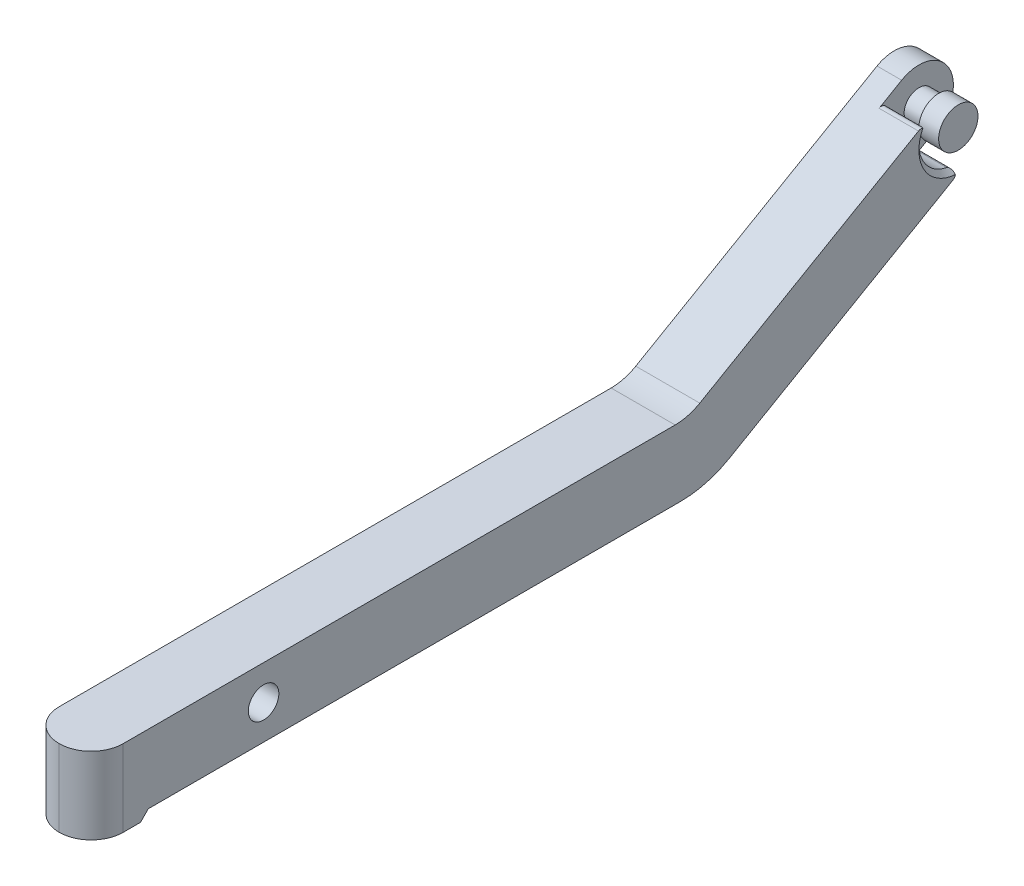
ISO-10303-21;
HEADER;
FILE_DESCRIPTION(('STEP AP214'),'2;1');
FILE_NAME('part.step','',(''),(''),'','','');
FILE_SCHEMA(('AUTOMOTIVE_DESIGN { 1 0 10303 214 1 1 1 1 }'));
ENDSEC;
DATA;
#1=APPLICATION_CONTEXT('core data for automotive mechanical design processes');
#2=APPLICATION_PROTOCOL_DEFINITION('international standard','automotive_design',2000,#1);
#3=PRODUCT_CONTEXT('',#1,'mechanical');
#4=PRODUCT('Part','Part','',(#3));
#5=PRODUCT_RELATED_PRODUCT_CATEGORY('part','',(#4));
#6=PRODUCT_DEFINITION_FORMATION('','',#4);
#7=PRODUCT_DEFINITION_CONTEXT('part definition',#1,'design');
#8=PRODUCT_DEFINITION('design','',#6,#7);
#9=PRODUCT_DEFINITION_SHAPE('','',#8);
#10=(LENGTH_UNIT() NAMED_UNIT(*) SI_UNIT(.MILLI.,.METRE.));
#11=(NAMED_UNIT(*) PLANE_ANGLE_UNIT() SI_UNIT($,.RADIAN.));
#12=(NAMED_UNIT(*) SI_UNIT($,.STERADIAN.) SOLID_ANGLE_UNIT());
#13=UNCERTAINTY_MEASURE_WITH_UNIT(LENGTH_MEASURE(1.E-05),#10,'distance_accuracy_value','');
#14=(GEOMETRIC_REPRESENTATION_CONTEXT(3) GLOBAL_UNCERTAINTY_ASSIGNED_CONTEXT((#13)) GLOBAL_UNIT_ASSIGNED_CONTEXT((#10,
#11,#12)) REPRESENTATION_CONTEXT('',''));
#15=CARTESIAN_POINT('',(0.,0.,0.));
#16=DIRECTION('',(0.,0.,1.));
#17=DIRECTION('',(1.,0.,0.));
#18=AXIS2_PLACEMENT_3D('',#15,#16,#17);
#19=CARTESIAN_POINT('',(3.25,15.2810889132454,-70.5298002192099));
#20=DIRECTION('',(-1.,0.,0.));
#21=DIRECTION('',(0.,0.,1.));
#22=AXIS2_PLACEMENT_3D('',#19,#20,#21);
#23=CYLINDRICAL_SURFACE('',#22,3.5);
#24=DIRECTION('',(-1.,0.,0.));
#25=VECTOR('',#24,1.);
#26=CARTESIAN_POINT('',(3.25,18.3121778264909,-68.7798002192099));
#27=LINE('',#26,#25);
#28=CARTESIAN_POINT('',(-0.75,18.3121778264909,-68.7798002192099));
#29=VERTEX_POINT('',#28);
#30=CARTESIAN_POINT('',(-3.25,18.3121778264909,-68.7798002192099));
#31=VERTEX_POINT('',#30);
#32=EDGE_CURVE('E176',#29,#31,#27,.T.);
#33=ORIENTED_EDGE('',*,*,#32,.F.);
#34=CARTESIAN_POINT('',(-0.75,15.2810889132454,-70.5298002192099));
#35=DIRECTION('',(1.,0.,0.));
#36=DIRECTION('',(0.,0.,-1.));
#37=AXIS2_PLACEMENT_3D('',#34,#35,#36);
#38=CIRCLE('',#37,3.50000000000001);
#39=CARTESIAN_POINT('',(-0.75,17.0310889132454,-73.5608891324555));
#40=VERTEX_POINT('',#39);
#41=EDGE_CURVE('E170',#40,#29,#38,.T.);
#42=ORIENTED_EDGE('',*,*,#41,.F.);
#43=DIRECTION('',(-1.,0.,0.));
#44=VECTOR('',#43,1.);
#45=CARTESIAN_POINT('',(3.25,17.0310889132454,-73.5608891324555));
#46=LINE('',#45,#44);
#47=CARTESIAN_POINT('',(-3.25,17.0310889132454,-73.5608891324555));
#48=VERTEX_POINT('',#47);
#49=EDGE_CURVE('E181',#48,#40,#46,.F.);
#50=ORIENTED_EDGE('',*,*,#49,.F.);
#51=CARTESIAN_POINT('',(-3.25,15.2810889132454,-70.5298002192099));
#52=DIRECTION('',(1.,0.,0.));
#53=DIRECTION('',(0.,0.,-1.));
#54=AXIS2_PLACEMENT_3D('',#51,#52,#53);
#55=CIRCLE('',#54,3.5);
#56=EDGE_CURVE('E420',#31,#48,#55,.F.);
#57=ORIENTED_EDGE('',*,*,#56,.F.);
#58=EDGE_LOOP('',(#33,#42,#50,#57));
#59=FACE_BOUND('',#58,.T.);
#60=ADVANCED_FACE('F41',(#59),#23,.T.);
#61=CARTESIAN_POINT('',(3.25,15.2810889132454,-70.5298002192099));
#62=DIRECTION('',(-1.,0.,0.));
#63=DIRECTION('',(0.,0.,1.));
#64=AXIS2_PLACEMENT_3D('',#61,#62,#63);
#65=CYLINDRICAL_SURFACE('',#64,3.5);
#66=ORIENTED_EDGE('',*,*,#49,.T.);
#67=CARTESIAN_POINT('',(-0.75,15.2810889132454,-70.5298002192099));
#68=DIRECTION('',(1.,0.,0.));
#69=DIRECTION('',(0.,0.,-1.));
#70=AXIS2_PLACEMENT_3D('',#67,#68,#69);
#71=CIRCLE('',#70,3.5);
#72=CARTESIAN_POINT('',(-0.75,12.2499999999999,-72.2798002192099));
#73=VERTEX_POINT('',#72);
#74=EDGE_CURVE('E167',#40,#73,#71,.F.);
#75=ORIENTED_EDGE('',*,*,#74,.T.);
#76=DIRECTION('',(-1.,0.,0.));
#77=VECTOR('',#76,1.);
#78=CARTESIAN_POINT('',(3.25,12.2499999999999,-72.2798002192099));
#79=LINE('',#78,#77);
#80=CARTESIAN_POINT('',(-3.25,12.2499999999999,-72.2798002192099));
#81=VERTEX_POINT('',#80);
#82=EDGE_CURVE('E423',#81,#73,#79,.F.);
#83=ORIENTED_EDGE('',*,*,#82,.F.);
#84=CARTESIAN_POINT('',(-3.25,15.2810889132454,-70.5298002192099));
#85=DIRECTION('',(1.,0.,0.));
#86=DIRECTION('',(0.,0.,-1.));
#87=AXIS2_PLACEMENT_3D('',#84,#85,#86);
#88=CIRCLE('',#87,3.5);
#89=EDGE_CURVE('E187',#48,#81,#88,.F.);
#90=ORIENTED_EDGE('',*,*,#89,.F.);
#91=EDGE_LOOP('',(#66,#75,#83,#90));
#92=FACE_BOUND('',#91,.T.);
#93=ADVANCED_FACE('F186',(#92),#65,.T.);
#94=CARTESIAN_POINT('',(3.25,0.,0.));
#95=DIRECTION('',(1.,0.,0.));
#96=DIRECTION('',(0.,0.,-1.));
#97=AXIS2_PLACEMENT_3D('',#94,#95,#96);
#98=PLANE('',#97);
#99=DIRECTION('',(0.,0.499999999999995,-0.866025403784442));
#100=VECTOR('',#99,1.);
#101=CARTESIAN_POINT('',(3.25,-3.49999999999999,-45.));
#102=LINE('',#101,#100);
#103=CARTESIAN_POINT('',(3.25,-2.16025403784441,-47.3205080756887));
#104=VERTEX_POINT('',#103);
#105=CARTESIAN_POINT('',(3.25,10.9271243444676,-69.988512371732));
#106=VERTEX_POINT('',#105);
#107=EDGE_CURVE('E344',#104,#106,#102,.T.);
#108=ORIENTED_EDGE('',*,*,#107,.T.);
#109=CARTESIAN_POINT('',(3.25,11.3601370463598,-69.738512371732));
#110=DIRECTION('',(1.,0.,0.));
#111=DIRECTION('',(0.,0.,-1.));
#112=AXIS2_PLACEMENT_3D('',#109,#110,#111);
#113=CIRCLE('',#112,0.5);
#114=CARTESIAN_POINT('',(3.25,11.2920518764218,-70.2338550911036));
#115=VERTEX_POINT('',#114);
#116=EDGE_CURVE('E210',#106,#115,#113,.T.);
#117=ORIENTED_EDGE('',*,*,#116,.T.);
#118=CARTESIAN_POINT('',(3.25,15.2810889132454,-70.5298002192099));
#119=DIRECTION('',(1.,0.,0.));
#120=DIRECTION('',(0.,0.,-1.));
#121=AXIS2_PLACEMENT_3D('',#118,#119,#120);
#122=CIRCLE('',#121,4.00000000000001);
#123=CARTESIAN_POINT('',(3.25,17.0193114325909,-66.9272202446306));
#124=VERTEX_POINT('',#123);
#125=EDGE_CURVE('E199',#115,#124,#122,.F.);
#126=ORIENTED_EDGE('',*,*,#125,.T.);
#127=CARTESIAN_POINT('',(3.25,16.5562894690664,-66.738512371732));
#128=DIRECTION('',(1.,0.,0.));
#129=DIRECTION('',(0.,0.,-1.));
#130=AXIS2_PLACEMENT_3D('',#127,#128,#129);
#131=CIRCLE('',#130,0.5);
#132=CARTESIAN_POINT('',(3.25,16.9893021709586,-66.488512371732));
#133=VERTEX_POINT('',#132);
#134=EDGE_CURVE('E207',#124,#133,#131,.T.);
#135=ORIENTED_EDGE('',*,*,#134,.T.);
#136=DIRECTION('',(0.,-0.499999999999995,0.866025403784441));
#137=VECTOR('',#136,1.);
#138=CARTESIAN_POINT('',(3.25,20.0621778264909,-71.8108891324555));
#139=LINE('',#138,#137);
#140=CARTESIAN_POINT('',(3.25,4.1698729810778,-44.2846096908266));
#141=VERTEX_POINT('',#140);
#142=EDGE_CURVE('E347',#133,#141,#139,.T.);
#143=ORIENTED_EDGE('',*,*,#142,.T.);
#144=CARTESIAN_POINT('',(3.25,8.5,-41.7846096908266));
#145=DIRECTION('',(1.,0.,0.));
#146=DIRECTION('',(0.,0.,-1.));
#147=AXIS2_PLACEMENT_3D('',#144,#145,#146);
#148=CIRCLE('',#147,5.);
#149=CARTESIAN_POINT('',(3.25,3.5,-41.7846096908266));
#150=VERTEX_POINT('',#149);
#151=EDGE_CURVE('E409',#141,#150,#148,.F.);
#152=ORIENTED_EDGE('',*,*,#151,.T.);
#153=DIRECTION('',(0.,0.,1.));
#154=VECTOR('',#153,1.);
#155=CARTESIAN_POINT('',(3.25,3.5,17.5));
#156=LINE('',#155,#154);
#157=CARTESIAN_POINT('',(3.25,3.5,14.25));
#158=VERTEX_POINT('',#157);
#159=EDGE_CURVE('E351',#150,#158,#156,.T.);
#160=ORIENTED_EDGE('',*,*,#159,.T.);
#161=DIRECTION('',(0.,-1.,0.));
#162=VECTOR('',#161,1.);
#163=CARTESIAN_POINT('',(3.25,0.,14.25));
#164=LINE('',#163,#162);
#165=CARTESIAN_POINT('',(3.25,-4.3,14.25));
#166=VERTEX_POINT('',#165);
#167=EDGE_CURVE('E398',#158,#166,#164,.T.);
#168=ORIENTED_EDGE('',*,*,#167,.T.);
#169=DIRECTION('',(0.,0.,-1.));
#170=VECTOR('',#169,1.);
#171=CARTESIAN_POINT('',(3.25,-4.3,12.5));
#172=LINE('',#171,#170);
#173=CARTESIAN_POINT('',(3.25,-4.3,12.5));
#174=VERTEX_POINT('',#173);
#175=EDGE_CURVE('E369',#166,#174,#172,.T.);
#176=ORIENTED_EDGE('',*,*,#175,.T.);
#177=DIRECTION('',(0.,0.70710678118655,-0.707106781186545));
#178=VECTOR('',#177,1.);
#179=CARTESIAN_POINT('',(3.25,-3.5,11.7));
#180=LINE('',#179,#178);
#181=CARTESIAN_POINT('',(3.25,-3.5,11.7));
#182=VERTEX_POINT('',#181);
#183=EDGE_CURVE('E371',#174,#182,#180,.T.);
#184=ORIENTED_EDGE('',*,*,#183,.T.);
#185=DIRECTION('',(0.,0.,-1.));
#186=VECTOR('',#185,1.);
#187=CARTESIAN_POINT('',(3.25,-3.5,0.));
#188=LINE('',#187,#186);
#189=CARTESIAN_POINT('',(3.25,-3.5,-42.3205080756888));
#190=VERTEX_POINT('',#189);
#191=EDGE_CURVE('E359',#182,#190,#188,.T.);
#192=ORIENTED_EDGE('',*,*,#191,.T.);
#193=CARTESIAN_POINT('',(3.25,6.5,-42.3205080756888));
#194=DIRECTION('',(1.,0.,0.));
#195=DIRECTION('',(0.,0.,-1.));
#196=AXIS2_PLACEMENT_3D('',#193,#194,#195);
#197=CIRCLE('',#196,10.);
#198=EDGE_CURVE('E418',#190,#104,#197,.T.);
#199=ORIENTED_EDGE('',*,*,#198,.T.);
#200=EDGE_LOOP('',(#108,#117,#126,#135,#143,#152,#160,#168,#176,#184,#192,#199));
#201=FACE_BOUND('',#200,.T.);
#202=CARTESIAN_POINT('',(3.25,0.,0.));
#203=DIRECTION('',(1.,0.,0.));
#204=DIRECTION('',(0.,0.,-1.));
#205=AXIS2_PLACEMENT_3D('',#202,#203,#204);
#206=CIRCLE('',#205,1.55);
#207=CARTESIAN_POINT('',(3.25,0.,1.55));
#208=VERTEX_POINT('',#207);
#209=EDGE_CURVE('E381',#208,#208,#206,.T.);
#210=ORIENTED_EDGE('',*,*,#209,.F.);
#211=EDGE_LOOP('',(#210));
#212=FACE_BOUND('',#211,.T.);
#213=ADVANCED_FACE('F250',(#201,#212),#98,.T.);
#214=CARTESIAN_POINT('',(-3.25,0.,0.));
#215=DIRECTION('',(1.,0.,0.));
#216=DIRECTION('',(0.,0.,-1.));
#217=AXIS2_PLACEMENT_3D('',#214,#215,#216);
#218=PLANE('',#217);
#219=ORIENTED_EDGE('',*,*,#56,.T.);
#220=ORIENTED_EDGE('',*,*,#89,.T.);
#221=DIRECTION('',(0.,0.499999999999995,-0.866025403784442));
#222=VECTOR('',#221,1.);
#223=CARTESIAN_POINT('',(-3.25,-3.49999999999999,-45.));
#224=LINE('',#223,#222);
#225=CARTESIAN_POINT('',(-3.25,-2.16025403784441,-47.3205080756887));
#226=VERTEX_POINT('',#225);
#227=EDGE_CURVE('E191',#226,#81,#224,.T.);
#228=ORIENTED_EDGE('',*,*,#227,.F.);
#229=CARTESIAN_POINT('',(-3.25,6.5,-42.3205080756888));
#230=DIRECTION('',(1.,0.,0.));
#231=DIRECTION('',(0.,0.,-1.));
#232=AXIS2_PLACEMENT_3D('',#229,#230,#231);
#233=CIRCLE('',#232,10.);
#234=CARTESIAN_POINT('',(-3.25,-3.5,-42.3205080756888));
#235=VERTEX_POINT('',#234);
#236=EDGE_CURVE('E414',#226,#235,#233,.F.);
#237=ORIENTED_EDGE('',*,*,#236,.T.);
#238=DIRECTION('',(0.,0.,-1.));
#239=VECTOR('',#238,1.);
#240=CARTESIAN_POINT('',(-3.25,-3.5,0.));
#241=LINE('',#240,#239);
#242=CARTESIAN_POINT('',(-3.25,-3.5,11.7));
#243=VERTEX_POINT('',#242);
#244=EDGE_CURVE('E364',#243,#235,#241,.T.);
#245=ORIENTED_EDGE('',*,*,#244,.F.);
#246=DIRECTION('',(0.,0.70710678118655,-0.707106781186545));
#247=VECTOR('',#246,1.);
#248=CARTESIAN_POINT('',(-3.25,-3.5,11.7));
#249=LINE('',#248,#247);
#250=CARTESIAN_POINT('',(-3.25,-4.3,12.5));
#251=VERTEX_POINT('',#250);
#252=EDGE_CURVE('E361',#251,#243,#249,.T.);
#253=ORIENTED_EDGE('',*,*,#252,.F.);
#254=DIRECTION('',(0.,0.,-1.));
#255=VECTOR('',#254,1.);
#256=CARTESIAN_POINT('',(-3.25,-4.3,12.5));
#257=LINE('',#256,#255);
#258=CARTESIAN_POINT('',(-3.25,-4.3,14.25));
#259=VERTEX_POINT('',#258);
#260=EDGE_CURVE('E358',#259,#251,#257,.T.);
#261=ORIENTED_EDGE('',*,*,#260,.F.);
#262=DIRECTION('',(0.,-1.,0.));
#263=VECTOR('',#262,1.);
#264=CARTESIAN_POINT('',(-3.25,3.5,14.25));
#265=LINE('',#264,#263);
#266=CARTESIAN_POINT('',(-3.25,3.5,14.25));
#267=VERTEX_POINT('',#266);
#268=EDGE_CURVE('E390',#259,#267,#265,.F.);
#269=ORIENTED_EDGE('',*,*,#268,.T.);
#270=DIRECTION('',(0.,0.,1.));
#271=VECTOR('',#270,1.);
#272=CARTESIAN_POINT('',(-3.25,3.5,17.5));
#273=LINE('',#272,#271);
#274=CARTESIAN_POINT('',(-3.25,3.5,-41.7846096908266));
#275=VERTEX_POINT('',#274);
#276=EDGE_CURVE('E356',#275,#267,#273,.T.);
#277=ORIENTED_EDGE('',*,*,#276,.F.);
#278=CARTESIAN_POINT('',(-3.25,8.5,-41.7846096908266));
#279=DIRECTION('',(1.,0.,0.));
#280=DIRECTION('',(0.,0.,-1.));
#281=AXIS2_PLACEMENT_3D('',#278,#279,#280);
#282=CIRCLE('',#281,5.);
#283=CARTESIAN_POINT('',(-3.25,4.1698729810778,-44.2846096908266));
#284=VERTEX_POINT('',#283);
#285=EDGE_CURVE('E406',#275,#284,#282,.T.);
#286=ORIENTED_EDGE('',*,*,#285,.T.);
#287=DIRECTION('',(0.,-0.499999999999995,0.866025403784441));
#288=VECTOR('',#287,1.);
#289=CARTESIAN_POINT('',(-3.25,20.0621778264909,-71.8108891324555));
#290=LINE('',#289,#288);
#291=EDGE_CURVE('E348',#31,#284,#290,.T.);
#292=ORIENTED_EDGE('',*,*,#291,.F.);
#293=EDGE_LOOP('',(#219,#220,#228,#237,#245,#253,#261,#269,#277,#286,#292));
#294=FACE_BOUND('',#293,.T.);
#295=CARTESIAN_POINT('',(-3.25,0.,0.));
#296=DIRECTION('',(1.,0.,0.));
#297=DIRECTION('',(0.,0.,-1.));
#298=AXIS2_PLACEMENT_3D('',#295,#296,#297);
#299=CIRCLE('',#298,1.55);
#300=CARTESIAN_POINT('',(-3.25,0.,1.55));
#301=VERTEX_POINT('',#300);
#302=EDGE_CURVE('E378',#301,#301,#299,.T.);
#303=ORIENTED_EDGE('',*,*,#302,.T.);
#304=EDGE_LOOP('',(#303));
#305=FACE_BOUND('',#304,.T.);
#306=ADVANCED_FACE('F255',(#294,#305),#218,.F.);
#307=CARTESIAN_POINT('',(3.25,0.,0.));
#308=DIRECTION('',(-1.,0.,0.));
#309=DIRECTION('',(0.,0.,1.));
#310=AXIS2_PLACEMENT_3D('',#307,#308,#309);
#311=CYLINDRICAL_SURFACE('',#310,1.55);
#312=CARTESIAN_POINT('',(3.25,0.,1.55));
#313=CARTESIAN_POINT('',(3.18229166666667,0.,1.55));
#314=CARTESIAN_POINT('',(3.11458333333333,0.,1.55));
#315=CARTESIAN_POINT('',(2.97916666666667,0.,1.55));
#316=CARTESIAN_POINT('',(2.91145833333333,0.,1.55));
#317=CARTESIAN_POINT('',(2.77604166666667,0.,1.55));
#318=CARTESIAN_POINT('',(2.70833333333333,0.,1.55));
#319=CARTESIAN_POINT('',(2.57291666666667,0.,1.55));
#320=CARTESIAN_POINT('',(2.50520833333333,0.,1.55));
#321=CARTESIAN_POINT('',(2.36979166666667,0.,1.55));
#322=CARTESIAN_POINT('',(2.30208333333333,0.,1.55));
#323=CARTESIAN_POINT('',(2.16666666666667,0.,1.55));
#324=CARTESIAN_POINT('',(2.09895833333333,0.,1.55));
#325=CARTESIAN_POINT('',(1.96354166666667,0.,1.55));
#326=CARTESIAN_POINT('',(1.89583333333333,0.,1.55));
#327=CARTESIAN_POINT('',(1.76041666666667,0.,1.55));
#328=CARTESIAN_POINT('',(1.69270833333333,0.,1.55));
#329=CARTESIAN_POINT('',(1.55729166666667,0.,1.55));
#330=CARTESIAN_POINT('',(1.48958333333333,0.,1.55));
#331=CARTESIAN_POINT('',(1.35416666666667,0.,1.55));
#332=CARTESIAN_POINT('',(1.28645833333333,0.,1.55));
#333=CARTESIAN_POINT('',(1.15104166666667,0.,1.55));
#334=CARTESIAN_POINT('',(1.08333333333333,0.,1.55));
#335=CARTESIAN_POINT('',(0.947916666666667,0.,1.55));
#336=CARTESIAN_POINT('',(0.880208333333333,0.,1.55));
#337=CARTESIAN_POINT('',(0.744791666666667,0.,1.55));
#338=CARTESIAN_POINT('',(0.677083333333333,0.,1.55));
#339=CARTESIAN_POINT('',(0.541666666666667,0.,1.55));
#340=CARTESIAN_POINT('',(0.473958333333333,0.,1.55));
#341=CARTESIAN_POINT('',(0.338541666666667,0.,1.55));
#342=CARTESIAN_POINT('',(0.270833333333333,0.,1.55));
#343=CARTESIAN_POINT('',(0.135416666666667,0.,1.55));
#344=CARTESIAN_POINT('',(0.0677083333333334,0.,1.55));
#345=CARTESIAN_POINT('',(-0.0677083333333334,0.,1.55));
#346=CARTESIAN_POINT('',(-0.135416666666667,0.,1.55));
#347=CARTESIAN_POINT('',(-0.270833333333333,0.,1.55));
#348=CARTESIAN_POINT('',(-0.338541666666667,0.,1.55));
#349=CARTESIAN_POINT('',(-0.473958333333333,0.,1.55));
#350=CARTESIAN_POINT('',(-0.541666666666667,0.,1.55));
#351=CARTESIAN_POINT('',(-0.677083333333333,0.,1.55));
#352=CARTESIAN_POINT('',(-0.744791666666666,0.,1.55));
#353=CARTESIAN_POINT('',(-0.880208333333333,0.,1.55));
#354=CARTESIAN_POINT('',(-0.947916666666666,0.,1.55));
#355=CARTESIAN_POINT('',(-1.08333333333333,0.,1.55));
#356=CARTESIAN_POINT('',(-1.15104166666667,0.,1.55));
#357=CARTESIAN_POINT('',(-1.28645833333333,0.,1.55));
#358=CARTESIAN_POINT('',(-1.35416666666667,0.,1.55));
#359=CARTESIAN_POINT('',(-1.48958333333333,0.,1.55));
#360=CARTESIAN_POINT('',(-1.55729166666667,0.,1.55));
#361=CARTESIAN_POINT('',(-1.69270833333333,0.,1.55));
#362=CARTESIAN_POINT('',(-1.76041666666667,0.,1.55));
#363=CARTESIAN_POINT('',(-1.89583333333333,0.,1.55));
#364=CARTESIAN_POINT('',(-1.96354166666667,0.,1.55));
#365=CARTESIAN_POINT('',(-2.09895833333333,0.,1.55));
#366=CARTESIAN_POINT('',(-2.16666666666667,0.,1.55));
#367=CARTESIAN_POINT('',(-2.30208333333333,0.,1.55));
#368=CARTESIAN_POINT('',(-2.36979166666667,0.,1.55));
#369=CARTESIAN_POINT('',(-2.50520833333333,0.,1.55));
#370=CARTESIAN_POINT('',(-2.57291666666667,0.,1.55));
#371=CARTESIAN_POINT('',(-2.70833333333333,0.,1.55));
#372=CARTESIAN_POINT('',(-2.77604166666667,0.,1.55));
#373=CARTESIAN_POINT('',(-2.91145833333333,0.,1.55));
#374=CARTESIAN_POINT('',(-2.97916666666667,0.,1.55));
#375=CARTESIAN_POINT('',(-3.11458333333333,0.,1.55));
#376=CARTESIAN_POINT('',(-3.18229166666667,0.,1.55));
#377=CARTESIAN_POINT('',(-3.25,0.,1.55));
#378=B_SPLINE_CURVE_WITH_KNOTS('',3,(#312,#313,#314,#315,#316,#317,#318,#319,#320,#321,#322,
#323,#324,#325,#326,#327,#328,#329,#330,#331,#332,#333,#334,#335,#336,#337,#338,#339,#340,#341,
#342,#343,#344,#345,#346,#347,#348,#349,#350,#351,#352,#353,#354,#355,#356,#357,#358,#359,#360,
#361,#362,#363,#364,#365,#366,#367,#368,#369,#370,#371,#372,#373,#374,#375,#376,#377),
.UNSPECIFIED.,.F.,.F.,(4,2,2,2,2,2,2,2,2,2,2,2,2,2,2,2,2,2,2,2,2,2,2,2,2,2,2,2,2,2,2,2,4),(0.,
0.203125,0.40625,0.609375,0.8125,1.015625,1.21875,1.421875,1.625,1.828125,2.03125,2.234375,
2.4375,2.640625,2.84375,3.046875,3.25,3.453125,3.65625,3.859375,4.0625,4.265625,4.46875,
4.671875,4.875,5.078125,5.28125,5.484375,5.6875,5.890625,6.09375,6.296875,6.5),.UNSPECIFIED.);
#379=EDGE_CURVE('BSEAM277',#208,#301,#378,.T.);
#380=ORIENTED_EDGE('',*,*,#209,.T.);
#381=ORIENTED_EDGE('',*,*,#302,.F.);
#382=ORIENTED_EDGE('',*,*,#379,.T.);
#383=ORIENTED_EDGE('',*,*,#379,.F.);
#384=EDGE_LOOP('',(#380,#382,#381,#383));
#385=FACE_BOUND('',#384,.T.);
#386=ADVANCED_FACE('F277',(#385),#311,.F.);
#387=CARTESIAN_POINT('',(-3.25,-3.5,0.));
#388=DIRECTION('',(0.,-1.,0.));
#389=DIRECTION('',(0.,0.,-1.));
#390=AXIS2_PLACEMENT_3D('',#387,#388,#389);
#391=PLANE('',#390);
#392=ORIENTED_EDGE('',*,*,#244,.T.);
#393=DIRECTION('',(-1.,0.,0.));
#394=VECTOR('',#393,1.);
#395=CARTESIAN_POINT('',(3.25,-3.49999999999999,-42.3205080756888));
#396=LINE('',#395,#394);
#397=EDGE_CURVE('E416',#235,#190,#396,.F.);
#398=ORIENTED_EDGE('',*,*,#397,.T.);
#399=ORIENTED_EDGE('',*,*,#191,.F.);
#400=DIRECTION('',(1.,0.,0.));
#401=VECTOR('',#400,1.);
#402=CARTESIAN_POINT('',(-3.25,-3.5,11.7));
#403=LINE('',#402,#401);
#404=EDGE_CURVE('E376',#243,#182,#403,.T.);
#405=ORIENTED_EDGE('',*,*,#404,.F.);
#406=EDGE_LOOP('',(#392,#398,#399,#405));
#407=FACE_BOUND('',#406,.T.);
#408=ADVANCED_FACE('F282',(#407),#391,.T.);
#409=CARTESIAN_POINT('',(-3.25,-3.5,11.7));
#410=DIRECTION('',(0.,-0.707106781186545,-0.70710678118655));
#411=DIRECTION('',(0.,0.70710678118655,-0.707106781186545));
#412=AXIS2_PLACEMENT_3D('',#409,#410,#411);
#413=PLANE('',#412);
#414=ORIENTED_EDGE('',*,*,#183,.F.);
#415=DIRECTION('',(1.,0.,0.));
#416=VECTOR('',#415,1.);
#417=CARTESIAN_POINT('',(-3.25,-4.3,12.5));
#418=LINE('',#417,#416);
#419=EDGE_CURVE('E367',#251,#174,#418,.T.);
#420=ORIENTED_EDGE('',*,*,#419,.F.);
#421=ORIENTED_EDGE('',*,*,#252,.T.);
#422=ORIENTED_EDGE('',*,*,#404,.T.);
#423=EDGE_LOOP('',(#414,#420,#421,#422));
#424=FACE_BOUND('',#423,.T.);
#425=ADVANCED_FACE('F292',(#424),#413,.T.);
#426=CARTESIAN_POINT('',(-3.25,-4.3,12.5));
#427=DIRECTION('',(0.,-1.,0.));
#428=DIRECTION('',(0.,0.,-1.));
#429=AXIS2_PLACEMENT_3D('',#426,#427,#428);
#430=PLANE('',#429);
#431=CARTESIAN_POINT('',(0.,-4.3,14.25));
#432=DIRECTION('',(0.,-1.,0.));
#433=DIRECTION('',(0.,0.,-1.));
#434=AXIS2_PLACEMENT_3D('',#431,#432,#433);
#435=CIRCLE('',#434,3.25);
#436=CARTESIAN_POINT('',(0.,-4.3,17.5));
#437=VERTEX_POINT('',#436);
#438=EDGE_CURVE('E384',#166,#437,#435,.T.);
#439=ORIENTED_EDGE('',*,*,#438,.T.);
#440=CARTESIAN_POINT('',(0.,-4.3,14.25));
#441=DIRECTION('',(0.,-1.,0.));
#442=DIRECTION('',(0.,0.,-1.));
#443=AXIS2_PLACEMENT_3D('',#440,#441,#442);
#444=CIRCLE('',#443,3.25);
#445=EDGE_CURVE('E388',#437,#259,#444,.T.);
#446=ORIENTED_EDGE('',*,*,#445,.T.);
#447=ORIENTED_EDGE('',*,*,#260,.T.);
#448=ORIENTED_EDGE('',*,*,#419,.T.);
#449=ORIENTED_EDGE('',*,*,#175,.F.);
#450=EDGE_LOOP('',(#439,#446,#447,#448,#449));
#451=FACE_BOUND('',#450,.T.);
#452=ADVANCED_FACE('F288',(#451),#430,.T.);
#453=CARTESIAN_POINT('',(-3.25,3.5,17.5));
#454=DIRECTION('',(0.,1.,0.));
#455=DIRECTION('',(0.,0.,1.));
#456=AXIS2_PLACEMENT_3D('',#453,#454,#455);
#457=PLANE('',#456);
#458=ORIENTED_EDGE('',*,*,#159,.F.);
#459=DIRECTION('',(-1.,0.,0.));
#460=VECTOR('',#459,1.);
#461=CARTESIAN_POINT('',(-3.25,3.5,-41.7846096908266));
#462=LINE('',#461,#460);
#463=EDGE_CURVE('E399',#150,#275,#462,.T.);
#464=ORIENTED_EDGE('',*,*,#463,.T.);
#465=ORIENTED_EDGE('',*,*,#276,.T.);
#466=CARTESIAN_POINT('',(0.,3.5,14.25));
#467=DIRECTION('',(0.,1.,0.));
#468=DIRECTION('',(0.,0.,1.));
#469=AXIS2_PLACEMENT_3D('',#466,#467,#468);
#470=CIRCLE('',#469,3.25);
#471=CARTESIAN_POINT('',(0.,3.5,17.5));
#472=VERTEX_POINT('',#471);
#473=EDGE_CURVE('E396',#267,#472,#470,.T.);
#474=ORIENTED_EDGE('',*,*,#473,.T.);
#475=CARTESIAN_POINT('',(0.,3.5,14.25));
#476=DIRECTION('',(0.,1.,0.));
#477=DIRECTION('',(0.,0.,1.));
#478=AXIS2_PLACEMENT_3D('',#475,#476,#477);
#479=CIRCLE('',#478,3.25);
#480=EDGE_CURVE('E393',#472,#158,#479,.T.);
#481=ORIENTED_EDGE('',*,*,#480,.T.);
#482=EDGE_LOOP('',(#458,#464,#465,#474,#481));
#483=FACE_BOUND('',#482,.T.);
#484=ADVANCED_FACE('F284',(#483),#457,.T.);
#485=CARTESIAN_POINT('',(3.25,-3.49999999999999,-45.));
#486=DIRECTION('',(0.,0.866025403784442,0.499999999999995));
#487=DIRECTION('',(0.,-0.499999999999995,0.866025403784442));
#488=AXIS2_PLACEMENT_3D('',#485,#486,#487);
#489=PLANE('',#488);
#490=DIRECTION('',(0.,-0.499999999999995,0.866025403784442));
#491=VECTOR('',#490,1.);
#492=CARTESIAN_POINT('',(-0.75,12.2499999999998,-72.2798002192099));
#493=LINE('',#492,#491);
#494=CARTESIAN_POINT('',(-0.75,10.9271243444676,-69.988512371732));
#495=VERTEX_POINT('',#494);
#496=EDGE_CURVE('E58',#73,#495,#493,.T.);
#497=ORIENTED_EDGE('',*,*,#496,.T.);
#498=DIRECTION('',(1.,0.,0.));
#499=VECTOR('',#498,1.);
#500=CARTESIAN_POINT('',(3.25,10.9271243444676,-69.988512371732));
#501=LINE('',#500,#499);
#502=EDGE_CURVE('E204',#495,#106,#501,.T.);
#503=ORIENTED_EDGE('',*,*,#502,.T.);
#504=ORIENTED_EDGE('',*,*,#107,.F.);
#505=DIRECTION('',(-1.,0.,0.));
#506=VECTOR('',#505,1.);
#507=CARTESIAN_POINT('',(-3.25,-2.16025403784441,-47.3205080756887));
#508=LINE('',#507,#506);
#509=EDGE_CURVE('E411',#104,#226,#508,.T.);
#510=ORIENTED_EDGE('',*,*,#509,.T.);
#511=ORIENTED_EDGE('',*,*,#227,.T.);
#512=ORIENTED_EDGE('',*,*,#82,.T.);
#513=EDGE_LOOP('',(#497,#503,#504,#510,#511,#512));
#514=FACE_BOUND('',#513,.T.);
#515=ADVANCED_FACE('F287',(#514),#489,.F.);
#516=CARTESIAN_POINT('',(3.25,20.0621778264909,-71.8108891324555));
#517=DIRECTION('',(0.,-0.866025403784441,-0.499999999999995));
#518=DIRECTION('',(0.,0.499999999999995,-0.866025403784441));
#519=AXIS2_PLACEMENT_3D('',#516,#517,#518);
#520=PLANE('',#519);
#521=ORIENTED_EDGE('',*,*,#142,.F.);
#522=DIRECTION('',(1.,0.,0.));
#523=VECTOR('',#522,1.);
#524=CARTESIAN_POINT('',(3.25,16.9893021709586,-66.488512371732));
#525=LINE('',#524,#523);
#526=CARTESIAN_POINT('',(-0.75,16.9893021709586,-66.488512371732));
#527=VERTEX_POINT('',#526);
#528=EDGE_CURVE('E434',#133,#527,#525,.F.);
#529=ORIENTED_EDGE('',*,*,#528,.T.);
#530=DIRECTION('',(0.,0.499999999999995,-0.866025403784441));
#531=VECTOR('',#530,1.);
#532=CARTESIAN_POINT('',(-0.75,18.3121778264909,-68.7798002192099));
#533=LINE('',#532,#531);
#534=EDGE_CURVE('E428',#527,#29,#533,.T.);
#535=ORIENTED_EDGE('',*,*,#534,.T.);
#536=ORIENTED_EDGE('',*,*,#32,.T.);
#537=ORIENTED_EDGE('',*,*,#291,.T.);
#538=DIRECTION('',(-1.,0.,0.));
#539=VECTOR('',#538,1.);
#540=CARTESIAN_POINT('',(3.25,4.1698729810778,-44.2846096908266));
#541=LINE('',#540,#539);
#542=EDGE_CURVE('E403',#284,#141,#541,.F.);
#543=ORIENTED_EDGE('',*,*,#542,.T.);
#544=EDGE_LOOP('',(#521,#529,#535,#536,#537,#543));
#545=FACE_BOUND('',#544,.T.);
#546=ADVANCED_FACE('F271',(#545),#520,.F.);
#547=CARTESIAN_POINT('',(0.,0.,14.25));
#548=DIRECTION('',(0.,-1.,0.));
#549=DIRECTION('',(0.,0.,-1.));
#550=AXIS2_PLACEMENT_3D('',#547,#548,#549);
#551=CYLINDRICAL_SURFACE('',#550,3.25);
#552=ORIENTED_EDGE('',*,*,#167,.F.);
#553=ORIENTED_EDGE('',*,*,#480,.F.);
#554=DIRECTION('',(0.,-1.,0.));
#555=VECTOR('',#554,1.);
#556=CARTESIAN_POINT('',(0.,-4.3,17.5));
#557=LINE('',#556,#555);
#558=EDGE_CURVE('E188',#437,#472,#557,.F.);
#559=ORIENTED_EDGE('',*,*,#558,.F.);
#560=ORIENTED_EDGE('',*,*,#438,.F.);
#561=EDGE_LOOP('',(#552,#553,#559,#560));
#562=FACE_BOUND('',#561,.T.);
#563=ADVANCED_FACE('F268',(#562),#551,.T.);
#564=CARTESIAN_POINT('',(0.,-4.3,14.25));
#565=DIRECTION('',(0.,1.,0.));
#566=DIRECTION('',(0.,0.,1.));
#567=AXIS2_PLACEMENT_3D('',#564,#565,#566);
#568=CYLINDRICAL_SURFACE('',#567,3.25);
#569=ORIENTED_EDGE('',*,*,#473,.F.);
#570=ORIENTED_EDGE('',*,*,#268,.F.);
#571=ORIENTED_EDGE('',*,*,#445,.F.);
#572=ORIENTED_EDGE('',*,*,#558,.T.);
#573=EDGE_LOOP('',(#569,#570,#571,#572));
#574=FACE_BOUND('',#573,.T.);
#575=ADVANCED_FACE('F266',(#574),#568,.T.);
#576=CARTESIAN_POINT('',(-3.25,8.5,-41.7846096908266));
#577=DIRECTION('',(-1.,0.,0.));
#578=DIRECTION('',(0.,0.,1.));
#579=AXIS2_PLACEMENT_3D('',#576,#577,#578);
#580=CYLINDRICAL_SURFACE('',#579,5.);
#581=ORIENTED_EDGE('',*,*,#151,.F.);
#582=ORIENTED_EDGE('',*,*,#542,.F.);
#583=ORIENTED_EDGE('',*,*,#285,.F.);
#584=ORIENTED_EDGE('',*,*,#463,.F.);
#585=EDGE_LOOP('',(#581,#582,#583,#584));
#586=FACE_BOUND('',#585,.T.);
#587=ADVANCED_FACE('F262',(#586),#580,.F.);
#588=CARTESIAN_POINT('',(3.25,6.5,-42.3205080756888));
#589=DIRECTION('',(1.,0.,0.));
#590=DIRECTION('',(0.,0.,-1.));
#591=AXIS2_PLACEMENT_3D('',#588,#589,#590);
#592=CYLINDRICAL_SURFACE('',#591,10.);
#593=ORIENTED_EDGE('',*,*,#198,.F.);
#594=ORIENTED_EDGE('',*,*,#397,.F.);
#595=ORIENTED_EDGE('',*,*,#236,.F.);
#596=ORIENTED_EDGE('',*,*,#509,.F.);
#597=EDGE_LOOP('',(#593,#594,#595,#596));
#598=FACE_BOUND('',#597,.T.);
#599=ADVANCED_FACE('F259',(#598),#592,.T.);
#600=CARTESIAN_POINT('',(-0.75,15.2810889132454,-70.5298002192099));
#601=DIRECTION('',(1.,0.,0.));
#602=DIRECTION('',(0.,0.,-1.));
#603=AXIS2_PLACEMENT_3D('',#600,#601,#602);
#604=CYLINDRICAL_SURFACE('',#603,3.50000000000001);
#605=CARTESIAN_POINT('',(2.75,15.2810889132454,-70.5298002192099));
#606=DIRECTION('',(1.,0.,0.));
#607=DIRECTION('',(0.,0.,-1.));
#608=AXIS2_PLACEMENT_3D('',#605,#606,#607);
#609=CIRCLE('',#608,3.50000000000001);
#610=CARTESIAN_POINT('',(2.75,16.3968893995888,-67.2124233526667));
#611=VERTEX_POINT('',#610);
#612=CARTESIAN_POINT('',(2.75,11.8502560297205,-69.8374233526667));
#613=VERTEX_POINT('',#612);
#614=EDGE_CURVE('E175',#611,#613,#609,.T.);
#615=ORIENTED_EDGE('',*,*,#614,.T.);
#616=DIRECTION('',(1.,0.,0.));
#617=VECTOR('',#616,1.);
#618=CARTESIAN_POINT('',(-0.75,11.8502560297205,-69.8374233526667));
#619=LINE('',#618,#617);
#620=CARTESIAN_POINT('',(-0.75,11.8502560297205,-69.8374233526667));
#621=VERTEX_POINT('',#620);
#622=EDGE_CURVE('E440',#613,#621,#619,.F.);
#623=ORIENTED_EDGE('',*,*,#622,.T.);
#624=CARTESIAN_POINT('',(-0.75,16.3968893995888,-67.2124233526667));
#625=VERTEX_POINT('',#624);
#626=EDGE_CURVE('E184',#625,#621,#38,.T.);
#627=ORIENTED_EDGE('',*,*,#626,.F.);
#628=DIRECTION('',(1.,0.,0.));
#629=VECTOR('',#628,1.);
#630=CARTESIAN_POINT('',(-0.75,16.3968893995888,-67.2124233526667));
#631=LINE('',#630,#629);
#632=EDGE_CURVE('E443',#625,#611,#631,.T.);
#633=ORIENTED_EDGE('',*,*,#632,.T.);
#634=EDGE_LOOP('',(#615,#623,#627,#633));
#635=FACE_BOUND('',#634,.T.);
#636=ADVANCED_FACE('F261',(#635),#604,.F.);
#637=CARTESIAN_POINT('',(-0.75,15.2810889132454,-70.5298002192099));
#638=DIRECTION('',(1.,0.,0.));
#639=DIRECTION('',(0.,0.,-1.));
#640=AXIS2_PLACEMENT_3D('',#637,#638,#639);
#641=PLANE('',#640);
#642=CARTESIAN_POINT('',(-0.75,15.2810889132454,-70.5298002192099));
#643=DIRECTION('',(1.,0.,0.));
#644=DIRECTION('',(0.,0.,-1.));
#645=AXIS2_PLACEMENT_3D('',#642,#643,#644);
#646=CIRCLE('',#645,1.5);
#647=CARTESIAN_POINT('',(-0.75,15.2810889132454,-72.0298002192099));
#648=VERTEX_POINT('',#647);
#649=EDGE_CURVE('E331',#648,#648,#646,.T.);
#650=ORIENTED_EDGE('',*,*,#649,.F.);
#651=EDGE_LOOP('',(#650));
#652=FACE_BOUND('',#651,.T.);
#653=ORIENTED_EDGE('',*,*,#41,.T.);
#654=ORIENTED_EDGE('',*,*,#534,.F.);
#655=CARTESIAN_POINT('',(-0.75,16.5562894690664,-66.738512371732));
#656=DIRECTION('',(1.,0.,0.));
#657=DIRECTION('',(0.,0.,-1.));
#658=AXIS2_PLACEMENT_3D('',#655,#656,#657);
#659=CIRCLE('',#658,0.5);
#660=EDGE_CURVE('E11',#527,#625,#659,.F.);
#661=ORIENTED_EDGE('',*,*,#660,.T.);
#662=ORIENTED_EDGE('',*,*,#626,.T.);
#663=CARTESIAN_POINT('',(-0.75,11.3601370463598,-69.738512371732));
#664=DIRECTION('',(1.,0.,0.));
#665=DIRECTION('',(0.,0.,-1.));
#666=AXIS2_PLACEMENT_3D('',#663,#664,#665);
#667=CIRCLE('',#666,0.5);
#668=EDGE_CURVE('E51',#621,#495,#667,.F.);
#669=ORIENTED_EDGE('',*,*,#668,.T.);
#670=ORIENTED_EDGE('',*,*,#496,.F.);
#671=ORIENTED_EDGE('',*,*,#74,.F.);
#672=EDGE_LOOP('',(#653,#654,#661,#662,#669,#670,#671));
#673=FACE_BOUND('',#672,.T.);
#674=ADVANCED_FACE('F169',(#652,#673),#641,.T.);
#675=CARTESIAN_POINT('',(1.25,15.2810889132454,-70.5298002192099));
#676=DIRECTION('',(-1.,0.,0.));
#677=DIRECTION('',(0.,0.,1.));
#678=AXIS2_PLACEMENT_3D('',#675,#676,#677);
#679=CYLINDRICAL_SURFACE('',#678,1.5);
#680=CARTESIAN_POINT('',(1.25,15.2810889132454,-70.5298002192099));
#681=DIRECTION('',(1.,0.,0.));
#682=DIRECTION('',(0.,0.,-1.));
#683=AXIS2_PLACEMENT_3D('',#680,#681,#682);
#684=CIRCLE('',#683,1.5);
#685=CARTESIAN_POINT('',(1.25,15.2810889132454,-72.0298002192099));
#686=VERTEX_POINT('',#685);
#687=EDGE_CURVE('E336',#686,#686,#684,.T.);
#688=ORIENTED_EDGE('',*,*,#687,.F.);
#689=EDGE_LOOP('',(#688));
#690=FACE_BOUND('',#689,.T.);
#691=ORIENTED_EDGE('',*,*,#649,.T.);
#692=EDGE_LOOP('',(#691));
#693=FACE_BOUND('',#692,.T.);
#694=ADVANCED_FACE('F311',(#690,#693),#679,.T.);
#695=CARTESIAN_POINT('',(3.25,15.2810889132454,-70.5298002192099));
#696=DIRECTION('',(-1.,0.,0.));
#697=DIRECTION('',(0.,0.,1.));
#698=AXIS2_PLACEMENT_3D('',#695,#696,#697);
#699=CYLINDRICAL_SURFACE('',#698,2.);
#700=CARTESIAN_POINT('',(3.25,15.2810889132454,-70.5298002192099));
#701=DIRECTION('',(1.,0.,0.));
#702=DIRECTION('',(0.,0.,-1.));
#703=AXIS2_PLACEMENT_3D('',#700,#701,#702);
#704=CIRCLE('',#703,2.);
#705=CARTESIAN_POINT('',(3.25,15.2810889132454,-72.5298002192099));
#706=VERTEX_POINT('',#705);
#707=EDGE_CURVE('E330',#706,#706,#704,.T.);
#708=ORIENTED_EDGE('',*,*,#707,.F.);
#709=EDGE_LOOP('',(#708));
#710=FACE_BOUND('',#709,.T.);
#711=CARTESIAN_POINT('',(1.25,15.2810889132454,-70.5298002192099));
#712=DIRECTION('',(1.,0.,0.));
#713=DIRECTION('',(0.,0.,-1.));
#714=AXIS2_PLACEMENT_3D('',#711,#712,#713);
#715=CIRCLE('',#714,2.);
#716=CARTESIAN_POINT('',(1.25,15.2810889132454,-72.5298002192099));
#717=VERTEX_POINT('',#716);
#718=EDGE_CURVE('E332',#717,#717,#715,.T.);
#719=ORIENTED_EDGE('',*,*,#718,.T.);
#720=EDGE_LOOP('',(#719));
#721=FACE_BOUND('',#720,.T.);
#722=ADVANCED_FACE('F315',(#710,#721),#699,.T.);
#723=CARTESIAN_POINT('',(3.25,15.2810889132454,-70.5298002192099));
#724=DIRECTION('',(1.,0.,0.));
#725=DIRECTION('',(0.,0.,-1.));
#726=AXIS2_PLACEMENT_3D('',#723,#724,#725);
#727=PLANE('',#726);
#728=ORIENTED_EDGE('',*,*,#707,.T.);
#729=EDGE_LOOP('',(#728));
#730=FACE_BOUND('',#729,.T.);
#731=ADVANCED_FACE('F319',(#730),#727,.T.);
#732=CARTESIAN_POINT('',(1.25,15.2810889132454,-70.5298002192099));
#733=DIRECTION('',(1.,0.,0.));
#734=DIRECTION('',(0.,0.,-1.));
#735=AXIS2_PLACEMENT_3D('',#732,#733,#734);
#736=PLANE('',#735);
#737=ORIENTED_EDGE('',*,*,#687,.T.);
#738=EDGE_LOOP('',(#737));
#739=FACE_BOUND('',#738,.T.);
#740=ORIENTED_EDGE('',*,*,#718,.F.);
#741=EDGE_LOOP('',(#740));
#742=FACE_BOUND('',#741,.T.);
#743=ADVANCED_FACE('F234',(#739,#742),#736,.F.);
#744=CARTESIAN_POINT('',(2.75,15.2810889132454,-70.5298002192099));
#745=DIRECTION('',(1.,0.,0.));
#746=DIRECTION('',(0.,0.,-1.));
#747=AXIS2_PLACEMENT_3D('',#744,#745,#746);
#748=CONICAL_SURFACE('',#747,3.50000000000001,0.785398163397453);
#749=ORIENTED_EDGE('',*,*,#125,.F.);
#750=CARTESIAN_POINT('',(3.25,11.2920518764218,-70.2338550911036));
#751=CARTESIAN_POINT('',(3.23061792225519,11.3112927565176,-70.2364925946225));
#752=CARTESIAN_POINT('',(3.21121371142574,11.3306362072592,-70.2380165747007));
#753=CARTESIAN_POINT('',(3.17244271656769,11.3694549452701,-70.2388044751033));
#754=CARTESIAN_POINT('',(3.15307601132535,11.3889303687319,-70.238065523812));
#755=CARTESIAN_POINT('',(3.09488887924488,11.4477142247638,-70.2323654163897));
#756=CARTESIAN_POINT('',(3.05632774688949,11.4870367548776,-70.2238728011786));
#757=CARTESIAN_POINT('',(2.99326793597182,11.5522742522061,-70.2009806144525));
#758=CARTESIAN_POINT('',(2.96813860692531,11.5785410719386,-70.189254234184));
#759=CARTESIAN_POINT('',(2.91980468779427,11.6298705540637,-70.1605372385957));
#760=CARTESIAN_POINT('',(2.89659377562525,11.6549370469642,-70.1435648659845));
#761=CARTESIAN_POINT('',(2.85956889332097,11.6960334696862,-70.1095426963691));
#762=CARTESIAN_POINT('',(2.84498461239632,11.7125721719954,-70.0939494578675));
#763=CARTESIAN_POINT('',(2.81802789410648,11.7441284114142,-70.0595928595016));
#764=CARTESIAN_POINT('',(2.80565298977832,11.7591476369261,-70.0408330814893));
#765=CARTESIAN_POINT('',(2.78636718671371,11.783897932658,-70.0045896102824));
#766=CARTESIAN_POINT('',(2.77885317109813,11.7940663684773,-69.9877283558585));
#767=CARTESIAN_POINT('',(2.76619893354724,11.8125974978227,-69.9522361039849));
#768=CARTESIAN_POINT('',(2.76105285426396,11.8209646194856,-69.9336096123333));
#769=CARTESIAN_POINT('',(2.75490442123419,11.8328519337865,-69.9019587725381));
#770=CARTESIAN_POINT('',(2.75307699108926,11.8370319165112,-69.8893364432546));
#771=CARTESIAN_POINT('',(2.75061966580524,11.8444083940434,-69.8636584260145));
#772=CARTESIAN_POINT('',(2.74999298056825,11.8476022335925,-69.8506016711383));
#773=CARTESIAN_POINT('',(2.75,11.8502560297205,-69.8374233526667));
#774=B_SPLINE_CURVE_WITH_KNOTS('',3,(#750,#751,#752,#753,#754,#755,#756,#757,#758,#759,#760,
#761,#762,#763,#764,#765,#766,#767,#768,#769,#770,#771,#772,#773),.UNSPECIFIED.,.F.,.F.,(4,2,2,
2,2,2,2,2,2,2,2,4),(0.,0.0822503321279658,0.164605081551248,0.330768105269316,0.445036147990319,
0.558911216078676,0.639685371475134,0.720368763549443,0.783357362381075,0.846189303214591,
0.886363202642048,0.926644348280556),.UNSPECIFIED.);
#775=EDGE_CURVE('E220',#115,#613,#774,.T.);
#776=ORIENTED_EDGE('',*,*,#775,.T.);
#777=ORIENTED_EDGE('',*,*,#614,.F.);
#778=CARTESIAN_POINT('',(2.75,16.3968893995888,-67.2124233526667));
#779=CARTESIAN_POINT('',(2.74995217984518,16.4174887857826,-67.2193928064962));
#780=CARTESIAN_POINT('',(2.75161839397566,16.4384945308336,-67.2249233628924));
#781=CARTESIAN_POINT('',(2.75794901102305,16.4803837344981,-67.2331621992872));
#782=CARTESIAN_POINT('',(2.76258158664267,16.5012661440824,-67.2358996485054));
#783=CARTESIAN_POINT('',(2.77440837214354,16.5423598037486,-67.2387449923474));
#784=CARTESIAN_POINT('',(2.78159274289921,16.5625733101928,-67.2388628779436));
#785=CARTESIAN_POINT('',(2.79802126048224,16.6020611330318,-67.2368060602457));
#786=CARTESIAN_POINT('',(2.80727119919147,16.6213326190594,-67.2346248449756));
#787=CARTESIAN_POINT('',(2.83230474194939,16.6678706299596,-67.2267226657734));
#788=CARTESIAN_POINT('',(2.84906360648817,16.6944048172582,-67.2197880167971));
#789=CARTESIAN_POINT('',(2.88492139875927,16.7445953736888,-67.202461131782));
#790=CARTESIAN_POINT('',(2.9040253081173,16.7682453959687,-67.1920614517294));
#791=CARTESIAN_POINT('',(2.95247782709168,16.8224381316597,-67.1633357436703));
#792=CARTESIAN_POINT('',(2.98264771628902,16.8514607509849,-67.1435332610155));
#793=CARTESIAN_POINT('',(3.04466945384794,16.9038469605711,-67.0995852914325));
#794=CARTESIAN_POINT('',(3.07652355170234,16.9272027369065,-67.0754338868359));
#795=CARTESIAN_POINT('',(3.132131878977,16.9626880454418,-67.0307717327259));
#796=CARTESIAN_POINT('',(3.15571340636751,16.9761400114055,-67.011077237227));
#797=CARTESIAN_POINT('',(3.20288183171627,16.9999873280882,-66.9702135202753));
#798=CARTESIAN_POINT('',(3.22646796925879,17.0103992747363,-66.9490531170305));
#799=CARTESIAN_POINT('',(3.25,17.0193114325909,-66.9272202446306));
#800=B_SPLINE_CURVE_WITH_KNOTS('',3,(#778,#779,#780,#781,#782,#783,#784,#785,#786,#787,#788,
#789,#790,#791,#792,#793,#794,#795,#796,#797,#798,#799),.UNSPECIFIED.,.F.,.F.,(4,2,2,2,2,2,2,2,
2,2,4),(0.,0.0650104440918369,0.12933479328068,0.19341376817897,0.257674729400469,
0.353557728841241,0.449648058790212,0.587839697698467,0.726220817681581,0.826676819913604,
0.926573699400315),.UNSPECIFIED.);
#801=EDGE_CURVE('E212',#611,#124,#800,.T.);
#802=ORIENTED_EDGE('',*,*,#801,.T.);
#803=EDGE_LOOP('',(#749,#776,#777,#802));
#804=FACE_BOUND('',#803,.T.);
#805=ADVANCED_FACE('F227',(#804),#748,.F.);
#806=CARTESIAN_POINT('',(-0.75,11.3601370463598,-69.738512371732));
#807=DIRECTION('',(1.,0.,0.));
#808=DIRECTION('',(0.,0.,-1.));
#809=AXIS2_PLACEMENT_3D('',#806,#807,#808);
#810=CYLINDRICAL_SURFACE('',#809,0.5);
#811=ORIENTED_EDGE('',*,*,#668,.F.);
#812=ORIENTED_EDGE('',*,*,#622,.F.);
#813=ORIENTED_EDGE('',*,*,#775,.F.);
#814=ORIENTED_EDGE('',*,*,#116,.F.);
#815=ORIENTED_EDGE('',*,*,#502,.F.);
#816=EDGE_LOOP('',(#811,#812,#813,#814,#815));
#817=FACE_BOUND('',#816,.T.);
#818=ADVANCED_FACE('F233',(#817),#810,.T.);
#819=CARTESIAN_POINT('',(-0.75,16.5562894690664,-66.738512371732));
#820=DIRECTION('',(1.,0.,0.));
#821=DIRECTION('',(0.,0.,-1.));
#822=AXIS2_PLACEMENT_3D('',#819,#820,#821);
#823=CYLINDRICAL_SURFACE('',#822,0.5);
#824=ORIENTED_EDGE('',*,*,#801,.F.);
#825=ORIENTED_EDGE('',*,*,#632,.F.);
#826=ORIENTED_EDGE('',*,*,#660,.F.);
#827=ORIENTED_EDGE('',*,*,#528,.F.);
#828=ORIENTED_EDGE('',*,*,#134,.F.);
#829=EDGE_LOOP('',(#824,#825,#826,#827,#828));
#830=FACE_BOUND('',#829,.T.);
#831=ADVANCED_FACE('F43',(#830),#823,.T.);
#832=CLOSED_SHELL('',(#60,#93,#213,#306,#386,#408,#425,#452,#484,#515,#546,#563,#575,#587,#599,
#636,#674,#694,#722,#731,#743,#805,#818,#831));
#833=MANIFOLD_SOLID_BREP('B2',#832);
#834=ADVANCED_BREP_SHAPE_REPRESENTATION('',(#18,#833),#14);
#835=SHAPE_DEFINITION_REPRESENTATION(#9,#834);
ENDSEC;
END-ISO-10303-21;
